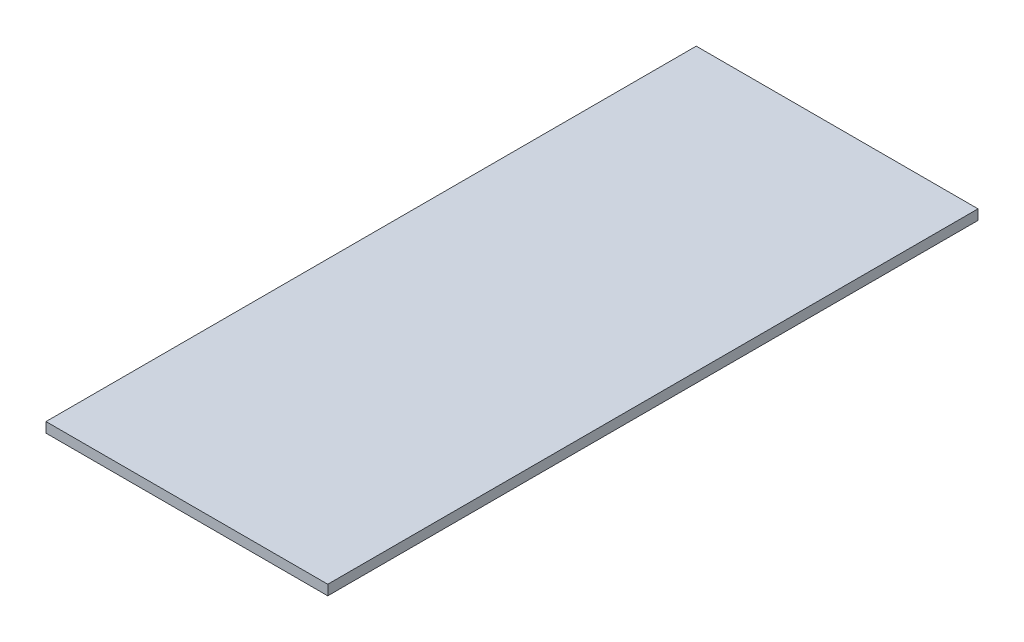
ISO-10303-21;
HEADER;
FILE_DESCRIPTION(('STEP AP214'),'2;1');
FILE_NAME('part.step','',(''),(''),'','','');
FILE_SCHEMA(('AUTOMOTIVE_DESIGN { 1 0 10303 214 1 1 1 1 }'));
ENDSEC;
DATA;
#1=APPLICATION_CONTEXT('core data for automotive mechanical design processes');
#2=APPLICATION_PROTOCOL_DEFINITION('international standard','automotive_design',2000,#1);
#3=PRODUCT_CONTEXT('',#1,'mechanical');
#4=PRODUCT('Part','Part','',(#3));
#5=PRODUCT_RELATED_PRODUCT_CATEGORY('part','',(#4));
#6=PRODUCT_DEFINITION_FORMATION('','',#4);
#7=PRODUCT_DEFINITION_CONTEXT('part definition',#1,'design');
#8=PRODUCT_DEFINITION('design','',#6,#7);
#9=PRODUCT_DEFINITION_SHAPE('','',#8);
#10=(LENGTH_UNIT() NAMED_UNIT(*) SI_UNIT(.MILLI.,.METRE.));
#11=(NAMED_UNIT(*) PLANE_ANGLE_UNIT() SI_UNIT($,.RADIAN.));
#12=(NAMED_UNIT(*) SI_UNIT($,.STERADIAN.) SOLID_ANGLE_UNIT());
#13=UNCERTAINTY_MEASURE_WITH_UNIT(LENGTH_MEASURE(1.E-05),#10,'distance_accuracy_value','');
#14=(GEOMETRIC_REPRESENTATION_CONTEXT(3) GLOBAL_UNCERTAINTY_ASSIGNED_CONTEXT((#13)) GLOBAL_UNIT_ASSIGNED_CONTEXT((#10,
#11,#12)) REPRESENTATION_CONTEXT('',''));
#15=CARTESIAN_POINT('',(0.,0.,0.));
#16=DIRECTION('',(0.,0.,1.));
#17=DIRECTION('',(1.,0.,0.));
#18=AXIS2_PLACEMENT_3D('',#15,#16,#17);
#19=CARTESIAN_POINT('',(0.,2.3622,0.));
#20=DIRECTION('',(1.,0.,0.));
#21=DIRECTION('',(0.,0.,-1.));
#22=AXIS2_PLACEMENT_3D('',#19,#20,#21);
#23=PLANE('',#22);
#24=DIRECTION('',(0.,0.,1.));
#25=VECTOR('',#24,1.);
#26=CARTESIAN_POINT('',(0.,0.,0.));
#27=LINE('',#26,#25);
#28=CARTESIAN_POINT('',(0.,0.,-152.4));
#29=VERTEX_POINT('',#28);
#30=CARTESIAN_POINT('',(0.,0.,0.));
#31=VERTEX_POINT('',#30);
#32=EDGE_CURVE('E111',#29,#31,#27,.T.);
#33=ORIENTED_EDGE('',*,*,#32,.T.);
#34=DIRECTION('',(0.,-1.,0.));
#35=VECTOR('',#34,1.);
#36=CARTESIAN_POINT('',(0.,2.3622,0.));
#37=LINE('',#36,#35);
#38=CARTESIAN_POINT('',(0.,2.3622,0.));
#39=VERTEX_POINT('',#38);
#40=EDGE_CURVE('E11',#39,#31,#37,.T.);
#41=ORIENTED_EDGE('',*,*,#40,.F.);
#42=DIRECTION('',(0.,0.,1.));
#43=VECTOR('',#42,1.);
#44=CARTESIAN_POINT('',(0.,2.3622,0.));
#45=LINE('',#44,#43);
#46=CARTESIAN_POINT('',(0.,2.3622,-152.4));
#47=VERTEX_POINT('',#46);
#48=EDGE_CURVE('E95',#47,#39,#45,.T.);
#49=ORIENTED_EDGE('',*,*,#48,.F.);
#50=DIRECTION('',(0.,-1.,0.));
#51=VECTOR('',#50,1.);
#52=CARTESIAN_POINT('',(0.,2.3622,-152.4));
#53=LINE('',#52,#51);
#54=EDGE_CURVE('E107',#47,#29,#53,.T.);
#55=ORIENTED_EDGE('',*,*,#54,.T.);
#56=EDGE_LOOP('',(#33,#41,#49,#55));
#57=FACE_BOUND('',#56,.T.);
#58=ADVANCED_FACE('F43',(#57),#23,.F.);
#59=CARTESIAN_POINT('',(0.,2.3622,0.));
#60=DIRECTION('',(0.,0.,-1.));
#61=DIRECTION('',(-1.,0.,0.));
#62=AXIS2_PLACEMENT_3D('',#59,#60,#61);
#63=PLANE('',#62);
#64=DIRECTION('',(1.,0.,0.));
#65=VECTOR('',#64,1.);
#66=CARTESIAN_POINT('',(0.,0.,0.));
#67=LINE('',#66,#65);
#68=CARTESIAN_POINT('',(66.04,0.,0.));
#69=VERTEX_POINT('',#68);
#70=EDGE_CURVE('E100',#31,#69,#67,.T.);
#71=ORIENTED_EDGE('',*,*,#70,.T.);
#72=DIRECTION('',(0.,-1.,0.));
#73=VECTOR('',#72,1.);
#74=CARTESIAN_POINT('',(66.04,2.3622,0.));
#75=LINE('',#74,#73);
#76=CARTESIAN_POINT('',(66.04,2.3622,0.));
#77=VERTEX_POINT('',#76);
#78=EDGE_CURVE('E52',#77,#69,#75,.T.);
#79=ORIENTED_EDGE('',*,*,#78,.F.);
#80=DIRECTION('',(1.,0.,0.));
#81=VECTOR('',#80,1.);
#82=CARTESIAN_POINT('',(0.,2.3622,0.));
#83=LINE('',#82,#81);
#84=EDGE_CURVE('E90',#39,#77,#83,.T.);
#85=ORIENTED_EDGE('',*,*,#84,.F.);
#86=ORIENTED_EDGE('',*,*,#40,.T.);
#87=EDGE_LOOP('',(#71,#79,#85,#86));
#88=FACE_BOUND('',#87,.T.);
#89=ADVANCED_FACE('F99',(#88),#63,.F.);
#90=CARTESIAN_POINT('',(66.04,2.3622,0.));
#91=DIRECTION('',(-1.,0.,0.));
#92=DIRECTION('',(0.,0.,1.));
#93=AXIS2_PLACEMENT_3D('',#90,#91,#92);
#94=PLANE('',#93);
#95=DIRECTION('',(0.,0.,-1.));
#96=VECTOR('',#95,1.);
#97=CARTESIAN_POINT('',(66.04,0.,0.));
#98=LINE('',#97,#96);
#99=CARTESIAN_POINT('',(66.04,0.,-152.4));
#100=VERTEX_POINT('',#99);
#101=EDGE_CURVE('E77',#69,#100,#98,.T.);
#102=ORIENTED_EDGE('',*,*,#101,.T.);
#103=DIRECTION('',(0.,-1.,0.));
#104=VECTOR('',#103,1.);
#105=CARTESIAN_POINT('',(66.04,2.3622,-152.4));
#106=LINE('',#105,#104);
#107=CARTESIAN_POINT('',(66.04,2.3622,-152.4));
#108=VERTEX_POINT('',#107);
#109=EDGE_CURVE('E102',#108,#100,#106,.T.);
#110=ORIENTED_EDGE('',*,*,#109,.F.);
#111=DIRECTION('',(0.,0.,-1.));
#112=VECTOR('',#111,1.);
#113=CARTESIAN_POINT('',(66.04,2.3622,0.));
#114=LINE('',#113,#112);
#115=EDGE_CURVE('E93',#77,#108,#114,.T.);
#116=ORIENTED_EDGE('',*,*,#115,.F.);
#117=ORIENTED_EDGE('',*,*,#78,.T.);
#118=EDGE_LOOP('',(#102,#110,#116,#117));
#119=FACE_BOUND('',#118,.T.);
#120=ADVANCED_FACE('F103',(#119),#94,.F.);
#121=CARTESIAN_POINT('',(0.,2.3622,-152.4));
#122=DIRECTION('',(0.,0.,1.));
#123=DIRECTION('',(1.,0.,0.));
#124=AXIS2_PLACEMENT_3D('',#121,#122,#123);
#125=PLANE('',#124);
#126=DIRECTION('',(-1.,0.,0.));
#127=VECTOR('',#126,1.);
#128=CARTESIAN_POINT('',(0.,0.,-152.4));
#129=LINE('',#128,#127);
#130=EDGE_CURVE('E83',#100,#29,#129,.T.);
#131=ORIENTED_EDGE('',*,*,#130,.T.);
#132=ORIENTED_EDGE('',*,*,#54,.F.);
#133=DIRECTION('',(-1.,0.,0.));
#134=VECTOR('',#133,1.);
#135=CARTESIAN_POINT('',(0.,2.3622,-152.4));
#136=LINE('',#135,#134);
#137=EDGE_CURVE('E60',#108,#47,#136,.T.);
#138=ORIENTED_EDGE('',*,*,#137,.F.);
#139=ORIENTED_EDGE('',*,*,#109,.T.);
#140=EDGE_LOOP('',(#131,#132,#138,#139));
#141=FACE_BOUND('',#140,.T.);
#142=ADVANCED_FACE('F124',(#141),#125,.F.);
#143=CARTESIAN_POINT('',(0.,2.3622,0.));
#144=DIRECTION('',(0.,-1.,0.));
#145=DIRECTION('',(0.,0.,-1.));
#146=AXIS2_PLACEMENT_3D('',#143,#144,#145);
#147=PLANE('',#146);
#148=ORIENTED_EDGE('',*,*,#48,.T.);
#149=ORIENTED_EDGE('',*,*,#84,.T.);
#150=ORIENTED_EDGE('',*,*,#115,.T.);
#151=ORIENTED_EDGE('',*,*,#137,.T.);
#152=EDGE_LOOP('',(#148,#149,#150,#151));
#153=FACE_BOUND('',#152,.T.);
#154=ADVANCED_FACE('F91',(#153),#147,.F.);
#155=CARTESIAN_POINT('',(0.,0.,0.));
#156=DIRECTION('',(0.,-1.,0.));
#157=DIRECTION('',(0.,0.,-1.));
#158=AXIS2_PLACEMENT_3D('',#155,#156,#157);
#159=PLANE('',#158);
#160=ORIENTED_EDGE('',*,*,#32,.F.);
#161=ORIENTED_EDGE('',*,*,#130,.F.);
#162=ORIENTED_EDGE('',*,*,#101,.F.);
#163=ORIENTED_EDGE('',*,*,#70,.F.);
#164=EDGE_LOOP('',(#160,#161,#162,#163));
#165=FACE_BOUND('',#164,.T.);
#166=ADVANCED_FACE('F127',(#165),#159,.T.);
#167=CLOSED_SHELL('',(#58,#89,#120,#142,#154,#166));
#168=MANIFOLD_SOLID_BREP('B2',#167);
#169=ADVANCED_BREP_SHAPE_REPRESENTATION('',(#18,#168),#14);
#170=SHAPE_DEFINITION_REPRESENTATION(#9,#169);
ENDSEC;
END-ISO-10303-21;
